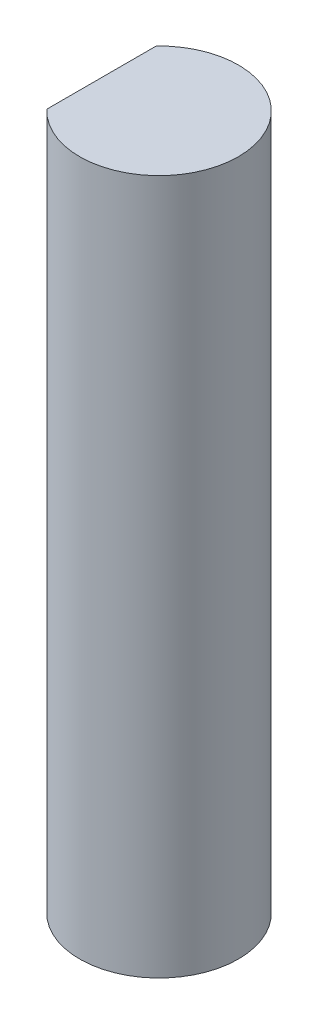
ISO-10303-21;
HEADER;
FILE_DESCRIPTION(('STEP AP214'),'2;1');
FILE_NAME('part.step','',(''),(''),'','','');
FILE_SCHEMA(('AUTOMOTIVE_DESIGN { 1 0 10303 214 1 1 1 1 }'));
ENDSEC;
DATA;
#1=APPLICATION_CONTEXT('core data for automotive mechanical design processes');
#2=APPLICATION_PROTOCOL_DEFINITION('international standard','automotive_design',2000,#1);
#3=PRODUCT_CONTEXT('',#1,'mechanical');
#4=PRODUCT('Part','Part','',(#3));
#5=PRODUCT_RELATED_PRODUCT_CATEGORY('part','',(#4));
#6=PRODUCT_DEFINITION_FORMATION('','',#4);
#7=PRODUCT_DEFINITION_CONTEXT('part definition',#1,'design');
#8=PRODUCT_DEFINITION('design','',#6,#7);
#9=PRODUCT_DEFINITION_SHAPE('','',#8);
#10=(LENGTH_UNIT() NAMED_UNIT(*) SI_UNIT(.MILLI.,.METRE.));
#11=(NAMED_UNIT(*) PLANE_ANGLE_UNIT() SI_UNIT($,.RADIAN.));
#12=(NAMED_UNIT(*) SI_UNIT($,.STERADIAN.) SOLID_ANGLE_UNIT());
#13=UNCERTAINTY_MEASURE_WITH_UNIT(LENGTH_MEASURE(1.E-05),#10,'distance_accuracy_value','');
#14=(GEOMETRIC_REPRESENTATION_CONTEXT(3) GLOBAL_UNCERTAINTY_ASSIGNED_CONTEXT((#13)) GLOBAL_UNIT_ASSIGNED_CONTEXT((#10,
#11,#12)) REPRESENTATION_CONTEXT('',''));
#15=CARTESIAN_POINT('',(0.,0.,0.));
#16=DIRECTION('',(0.,0.,1.));
#17=DIRECTION('',(1.,0.,0.));
#18=AXIS2_PLACEMENT_3D('',#15,#16,#17);
#19=CARTESIAN_POINT('',(0.,35.,0.));
#20=DIRECTION('',(0.,-1.,0.));
#21=DIRECTION('',(0.,0.,-1.));
#22=AXIS2_PLACEMENT_3D('',#19,#20,#21);
#23=CYLINDRICAL_SURFACE('',#22,4.);
#24=CARTESIAN_POINT('',(0.,35.,0.));
#25=DIRECTION('',(0.,1.,0.));
#26=DIRECTION('',(0.,0.,1.));
#27=AXIS2_PLACEMENT_3D('',#24,#25,#26);
#28=CIRCLE('',#27,4.);
#29=CARTESIAN_POINT('',(-2.89898379104728,35.,2.75606476325306));
#30=VERTEX_POINT('',#29);
#31=CARTESIAN_POINT('',(-2.89898379104728,35.,-2.75606476325305));
#32=VERTEX_POINT('',#31);
#33=EDGE_CURVE('E53',#30,#32,#28,.T.);
#34=ORIENTED_EDGE('',*,*,#33,.F.);
#35=DIRECTION('',(0.,-1.,0.));
#36=VECTOR('',#35,1.);
#37=CARTESIAN_POINT('',(-2.89898379104728,35.,2.75606476325306));
#38=LINE('',#37,#36);
#39=CARTESIAN_POINT('',(-2.89898379104728,0.,2.75606476325306));
#40=VERTEX_POINT('',#39);
#41=EDGE_CURVE('E64',#30,#40,#38,.T.);
#42=ORIENTED_EDGE('',*,*,#41,.T.);
#43=CARTESIAN_POINT('',(0.,0.,0.));
#44=DIRECTION('',(0.,1.,0.));
#45=DIRECTION('',(0.,0.,1.));
#46=AXIS2_PLACEMENT_3D('',#43,#44,#45);
#47=CIRCLE('',#46,4.);
#48=CARTESIAN_POINT('',(-2.89898379104728,0.,-2.75606476325306));
#49=VERTEX_POINT('',#48);
#50=EDGE_CURVE('E75',#40,#49,#47,.T.);
#51=ORIENTED_EDGE('',*,*,#50,.T.);
#52=DIRECTION('',(0.,-1.,0.));
#53=VECTOR('',#52,1.);
#54=CARTESIAN_POINT('',(-2.89898379104728,35.,-2.75606476325306));
#55=LINE('',#54,#53);
#56=EDGE_CURVE('E60',#49,#32,#55,.F.);
#57=ORIENTED_EDGE('',*,*,#56,.T.);
#58=EDGE_LOOP('',(#34,#42,#51,#57));
#59=FACE_BOUND('',#58,.T.);
#60=ADVANCED_FACE('F45',(#59),#23,.T.);
#61=CARTESIAN_POINT('',(0.,35.,0.));
#62=DIRECTION('',(0.,1.,0.));
#63=DIRECTION('',(0.,0.,1.));
#64=AXIS2_PLACEMENT_3D('',#61,#62,#63);
#65=PLANE('',#64);
#66=DIRECTION('',(0.,0.,1.));
#67=VECTOR('',#66,1.);
#68=CARTESIAN_POINT('',(-2.89898379104728,35.,2.89356512975573));
#69=LINE('',#68,#67);
#70=EDGE_CURVE('E86',#32,#30,#69,.T.);
#71=ORIENTED_EDGE('',*,*,#70,.T.);
#72=ORIENTED_EDGE('',*,*,#33,.T.);
#73=EDGE_LOOP('',(#71,#72));
#74=FACE_BOUND('',#73,.T.);
#75=ADVANCED_FACE('F89',(#74),#65,.T.);
#76=CARTESIAN_POINT('',(0.,0.,0.));
#77=DIRECTION('',(0.,1.,0.));
#78=DIRECTION('',(0.,0.,1.));
#79=AXIS2_PLACEMENT_3D('',#76,#77,#78);
#80=PLANE('',#79);
#81=ORIENTED_EDGE('',*,*,#50,.F.);
#82=DIRECTION('',(0.,0.,-1.));
#83=VECTOR('',#82,1.);
#84=CARTESIAN_POINT('',(-2.89898379104728,0.,0.));
#85=LINE('',#84,#83);
#86=EDGE_CURVE('E11',#40,#49,#85,.T.);
#87=ORIENTED_EDGE('',*,*,#86,.T.);
#88=EDGE_LOOP('',(#81,#87));
#89=FACE_BOUND('',#88,.T.);
#90=ADVANCED_FACE('F79',(#89),#80,.F.);
#91=CARTESIAN_POINT('',(-2.89898379104728,35.,2.89356512975573));
#92=DIRECTION('',(1.,0.,0.));
#93=DIRECTION('',(0.,0.,-1.));
#94=AXIS2_PLACEMENT_3D('',#91,#92,#93);
#95=PLANE('',#94);
#96=ORIENTED_EDGE('',*,*,#70,.F.);
#97=ORIENTED_EDGE('',*,*,#56,.F.);
#98=ORIENTED_EDGE('',*,*,#86,.F.);
#99=ORIENTED_EDGE('',*,*,#41,.F.);
#100=EDGE_LOOP('',(#96,#97,#98,#99));
#101=FACE_BOUND('',#100,.T.);
#102=ADVANCED_FACE('F69',(#101),#95,.F.);
#103=CLOSED_SHELL('',(#60,#75,#90,#102));
#104=MANIFOLD_SOLID_BREP('B2',#103);
#105=ADVANCED_BREP_SHAPE_REPRESENTATION('',(#18,#104),#14);
#106=SHAPE_DEFINITION_REPRESENTATION(#9,#105);
ENDSEC;
END-ISO-10303-21;
